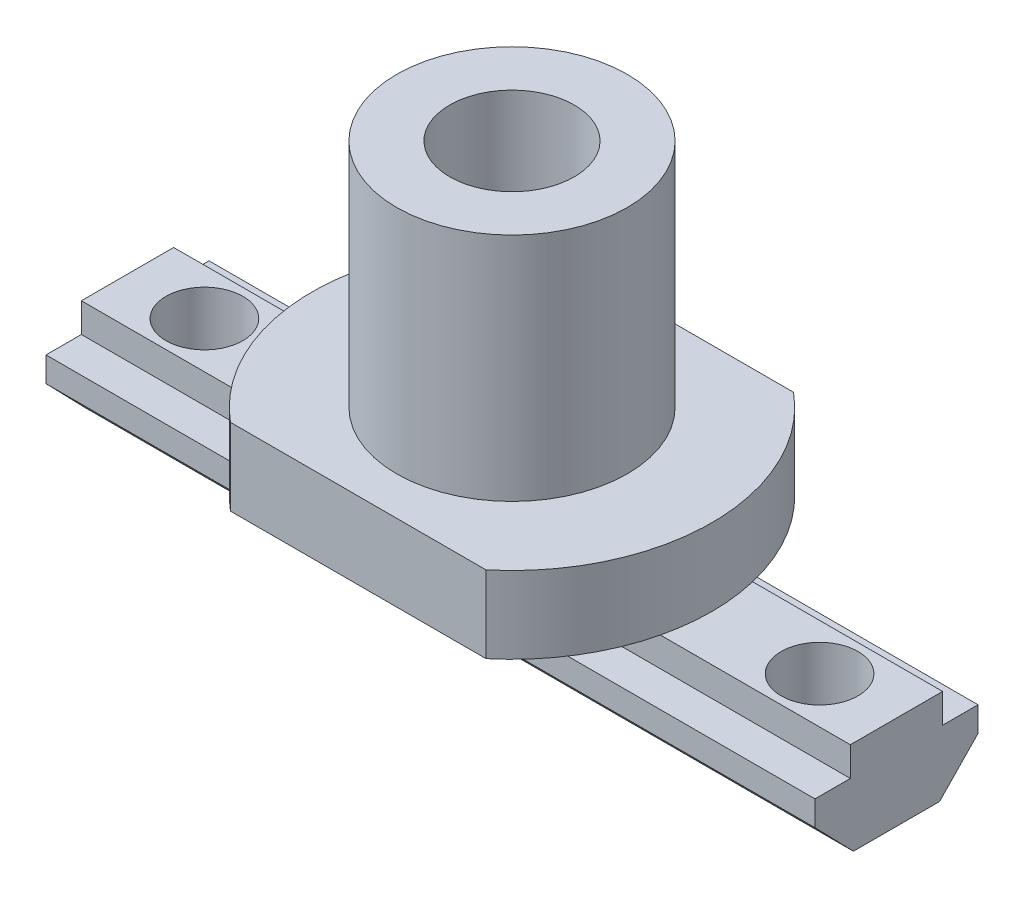
ISO-10303-21;
HEADER;
FILE_DESCRIPTION(('STEP AP214'),'2;1');
FILE_NAME('part.step','',(''),(''),'','','');
FILE_SCHEMA(('AUTOMOTIVE_DESIGN { 1 0 10303 214 1 1 1 1 }'));
ENDSEC;
DATA;
#1=APPLICATION_CONTEXT('core data for automotive mechanical design processes');
#2=APPLICATION_PROTOCOL_DEFINITION('international standard','automotive_design',2000,#1);
#3=PRODUCT_CONTEXT('',#1,'mechanical');
#4=PRODUCT('Part','Part','',(#3));
#5=PRODUCT_RELATED_PRODUCT_CATEGORY('part','',(#4));
#6=PRODUCT_DEFINITION_FORMATION('','',#4);
#7=PRODUCT_DEFINITION_CONTEXT('part definition',#1,'design');
#8=PRODUCT_DEFINITION('design','',#6,#7);
#9=PRODUCT_DEFINITION_SHAPE('','',#8);
#10=(LENGTH_UNIT() NAMED_UNIT(*) SI_UNIT(.MILLI.,.METRE.));
#11=(NAMED_UNIT(*) PLANE_ANGLE_UNIT() SI_UNIT($,.RADIAN.));
#12=(NAMED_UNIT(*) SI_UNIT($,.STERADIAN.) SOLID_ANGLE_UNIT());
#13=UNCERTAINTY_MEASURE_WITH_UNIT(LENGTH_MEASURE(1.E-05),#10,'distance_accuracy_value','');
#14=(GEOMETRIC_REPRESENTATION_CONTEXT(3) GLOBAL_UNCERTAINTY_ASSIGNED_CONTEXT((#13)) GLOBAL_UNIT_ASSIGNED_CONTEXT((#10,
#11,#12)) REPRESENTATION_CONTEXT('',''));
#15=CARTESIAN_POINT('',(0.,0.,0.));
#16=DIRECTION('',(0.,0.,1.));
#17=DIRECTION('',(1.,0.,0.));
#18=AXIS2_PLACEMENT_3D('',#15,#16,#17);
#19=CARTESIAN_POINT('',(25.,6.1,3.));
#20=DIRECTION('',(0.,-1.,0.));
#21=DIRECTION('',(0.,0.,-1.));
#22=AXIS2_PLACEMENT_3D('',#19,#20,#21);
#23=PLANE('',#22);
#24=CARTESIAN_POINT('',(-20.,6.1,0.));
#25=DIRECTION('',(0.,1.,0.));
#26=DIRECTION('',(0.,0.,1.));
#27=AXIS2_PLACEMENT_3D('',#24,#25,#26);
#28=CIRCLE('',#27,2.5);
#29=CARTESIAN_POINT('',(-20.,6.1,2.5));
#30=VERTEX_POINT('',#29);
#31=EDGE_CURVE('E445',#30,#30,#28,.T.);
#32=ORIENTED_EDGE('',*,*,#31,.F.);
#33=EDGE_LOOP('',(#32));
#34=FACE_BOUND('',#33,.T.);
#35=CARTESIAN_POINT('',(0.,6.1,0.));
#36=DIRECTION('',(0.,1.,0.));
#37=DIRECTION('',(0.,0.,1.));
#38=AXIS2_PLACEMENT_3D('',#35,#36,#37);
#39=CIRCLE('',#38,13.);
#40=CARTESIAN_POINT('',(-12.6491106406735,6.1,-3.));
#41=VERTEX_POINT('',#40);
#42=CARTESIAN_POINT('',(-12.6491106406735,6.1,3.));
#43=VERTEX_POINT('',#42);
#44=EDGE_CURVE('E49',#41,#43,#39,.T.);
#45=ORIENTED_EDGE('',*,*,#44,.F.);
#46=DIRECTION('',(-1.,0.,0.));
#47=VECTOR('',#46,1.);
#48=CARTESIAN_POINT('',(25.,6.1,-3.));
#49=LINE('',#48,#47);
#50=CARTESIAN_POINT('',(-25.,6.1,-3.));
#51=VERTEX_POINT('',#50);
#52=EDGE_CURVE('E306',#41,#51,#49,.T.);
#53=ORIENTED_EDGE('',*,*,#52,.T.);
#54=DIRECTION('',(0.,0.,1.));
#55=VECTOR('',#54,1.);
#56=CARTESIAN_POINT('',(-25.,6.1,3.));
#57=LINE('',#56,#55);
#58=CARTESIAN_POINT('',(-25.,6.1,3.));
#59=VERTEX_POINT('',#58);
#60=EDGE_CURVE('E244',#51,#59,#57,.T.);
#61=ORIENTED_EDGE('',*,*,#60,.T.);
#62=DIRECTION('',(-1.,0.,0.));
#63=VECTOR('',#62,1.);
#64=CARTESIAN_POINT('',(25.,6.1,3.));
#65=LINE('',#64,#63);
#66=EDGE_CURVE('E191',#43,#59,#65,.T.);
#67=ORIENTED_EDGE('',*,*,#66,.F.);
#68=EDGE_LOOP('',(#45,#53,#61,#67));
#69=FACE_BOUND('',#68,.T.);
#70=ADVANCED_FACE('F39',(#34,#69),#23,.F.);
#71=CARTESIAN_POINT('',(25.,6.1,3.));
#72=DIRECTION('',(0.,0.,-1.));
#73=DIRECTION('',(-1.,0.,0.));
#74=AXIS2_PLACEMENT_3D('',#71,#72,#73);
#75=PLANE('',#74);
#76=DIRECTION('',(0.,-1.,0.));
#77=VECTOR('',#76,1.);
#78=CARTESIAN_POINT('',(-25.,6.1,3.));
#79=LINE('',#78,#77);
#80=CARTESIAN_POINT('',(-25.,4.2,3.));
#81=VERTEX_POINT('',#80);
#82=EDGE_CURVE('E216',#59,#81,#79,.T.);
#83=ORIENTED_EDGE('',*,*,#82,.T.);
#84=DIRECTION('',(-1.,0.,0.));
#85=VECTOR('',#84,1.);
#86=CARTESIAN_POINT('',(25.,4.2,3.));
#87=LINE('',#86,#85);
#88=CARTESIAN_POINT('',(25.,4.2,3.));
#89=VERTEX_POINT('',#88);
#90=EDGE_CURVE('E43',#89,#81,#87,.T.);
#91=ORIENTED_EDGE('',*,*,#90,.F.);
#92=DIRECTION('',(0.,-1.,0.));
#93=VECTOR('',#92,1.);
#94=CARTESIAN_POINT('',(25.,6.1,3.));
#95=LINE('',#94,#93);
#96=CARTESIAN_POINT('',(25.,6.1,3.));
#97=VERTEX_POINT('',#96);
#98=EDGE_CURVE('E246',#97,#89,#95,.T.);
#99=ORIENTED_EDGE('',*,*,#98,.F.);
#100=CARTESIAN_POINT('',(12.6491106406735,6.1,3.));
#101=VERTEX_POINT('',#100);
#102=EDGE_CURVE('E193',#97,#101,#65,.T.);
#103=ORIENTED_EDGE('',*,*,#102,.T.);
#104=CARTESIAN_POINT('',(2.72075357208256,6.1,3.));
#105=VERTEX_POINT('',#104);
#106=EDGE_CURVE('E196',#101,#105,#65,.T.);
#107=ORIENTED_EDGE('',*,*,#106,.T.);
#108=CARTESIAN_POINT('',(-2.72075357208256,6.1,3.));
#109=VERTEX_POINT('',#108);
#110=EDGE_CURVE('E175',#105,#109,#65,.T.);
#111=ORIENTED_EDGE('',*,*,#110,.T.);
#112=EDGE_CURVE('E183',#109,#43,#65,.T.);
#113=ORIENTED_EDGE('',*,*,#112,.T.);
#114=ORIENTED_EDGE('',*,*,#66,.T.);
#115=EDGE_LOOP('',(#83,#91,#99,#103,#107,#111,#113,#114));
#116=FACE_BOUND('',#115,.T.);
#117=ADVANCED_FACE('F41',(#116),#75,.F.);
#118=CARTESIAN_POINT('',(25.,4.2,3.));
#119=DIRECTION('',(0.,-1.,0.));
#120=DIRECTION('',(0.,0.,-1.));
#121=AXIS2_PLACEMENT_3D('',#118,#119,#120);
#122=PLANE('',#121);
#123=DIRECTION('',(0.,0.,1.));
#124=VECTOR('',#123,1.);
#125=CARTESIAN_POINT('',(-25.,4.2,3.));
#126=LINE('',#125,#124);
#127=CARTESIAN_POINT('',(-25.,4.2,5.3));
#128=VERTEX_POINT('',#127);
#129=EDGE_CURVE('E219',#81,#128,#126,.T.);
#130=ORIENTED_EDGE('',*,*,#129,.T.);
#131=DIRECTION('',(-1.,0.,0.));
#132=VECTOR('',#131,1.);
#133=CARTESIAN_POINT('',(25.,4.2,5.3));
#134=LINE('',#133,#132);
#135=CARTESIAN_POINT('',(25.,4.2,5.3));
#136=VERTEX_POINT('',#135);
#137=EDGE_CURVE('E310',#136,#128,#134,.T.);
#138=ORIENTED_EDGE('',*,*,#137,.F.);
#139=DIRECTION('',(0.,0.,1.));
#140=VECTOR('',#139,1.);
#141=CARTESIAN_POINT('',(25.,4.2,3.));
#142=LINE('',#141,#140);
#143=EDGE_CURVE('E251',#89,#136,#142,.T.);
#144=ORIENTED_EDGE('',*,*,#143,.F.);
#145=ORIENTED_EDGE('',*,*,#90,.T.);
#146=EDGE_LOOP('',(#130,#138,#144,#145));
#147=FACE_BOUND('',#146,.T.);
#148=ADVANCED_FACE('F421',(#147),#122,.F.);
#149=CARTESIAN_POINT('',(25.,4.2,5.3));
#150=DIRECTION('',(0.,0.,-1.));
#151=DIRECTION('',(-1.,0.,0.));
#152=AXIS2_PLACEMENT_3D('',#149,#150,#151);
#153=PLANE('',#152);
#154=DIRECTION('',(0.,-1.,0.));
#155=VECTOR('',#154,1.);
#156=CARTESIAN_POINT('',(-25.,4.2,5.3));
#157=LINE('',#156,#155);
#158=CARTESIAN_POINT('',(-25.,2.58,5.3));
#159=VERTEX_POINT('',#158);
#160=EDGE_CURVE('E223',#128,#159,#157,.T.);
#161=ORIENTED_EDGE('',*,*,#160,.T.);
#162=DIRECTION('',(-1.,0.,0.));
#163=VECTOR('',#162,1.);
#164=CARTESIAN_POINT('',(25.,2.58,5.3));
#165=LINE('',#164,#163);
#166=CARTESIAN_POINT('',(25.,2.58,5.3));
#167=VERTEX_POINT('',#166);
#168=EDGE_CURVE('E317',#167,#159,#165,.T.);
#169=ORIENTED_EDGE('',*,*,#168,.F.);
#170=DIRECTION('',(0.,-1.,0.));
#171=VECTOR('',#170,1.);
#172=CARTESIAN_POINT('',(25.,4.2,5.3));
#173=LINE('',#172,#171);
#174=EDGE_CURVE('E256',#136,#167,#173,.T.);
#175=ORIENTED_EDGE('',*,*,#174,.F.);
#176=ORIENTED_EDGE('',*,*,#137,.T.);
#177=EDGE_LOOP('',(#161,#169,#175,#176));
#178=FACE_BOUND('',#177,.T.);
#179=ADVANCED_FACE('F513',(#178),#153,.F.);
#180=CARTESIAN_POINT('',(25.,0.,2.8));
#181=DIRECTION('',(0.,0.695884956767445,-0.718153275384003));
#182=DIRECTION('',(0.,0.718153275384003,0.695884956767445));
#183=AXIS2_PLACEMENT_3D('',#180,#181,#182);
#184=PLANE('',#183);
#185=DIRECTION('',(0.,-0.718153275384003,-0.695884956767445));
#186=VECTOR('',#185,1.);
#187=CARTESIAN_POINT('',(-25.,0.,2.8));
#188=LINE('',#187,#186);
#189=CARTESIAN_POINT('',(-25.,0.,2.8));
#190=VERTEX_POINT('',#189);
#191=EDGE_CURVE('E226',#159,#190,#188,.T.);
#192=ORIENTED_EDGE('',*,*,#191,.T.);
#193=DIRECTION('',(-1.,0.,0.));
#194=VECTOR('',#193,1.);
#195=CARTESIAN_POINT('',(25.,0.,2.8));
#196=LINE('',#195,#194);
#197=CARTESIAN_POINT('',(25.,0.,2.8));
#198=VERTEX_POINT('',#197);
#199=EDGE_CURVE('E324',#198,#190,#196,.T.);
#200=ORIENTED_EDGE('',*,*,#199,.F.);
#201=DIRECTION('',(0.,-0.718153275384003,-0.695884956767445));
#202=VECTOR('',#201,1.);
#203=CARTESIAN_POINT('',(25.,0.,2.8));
#204=LINE('',#203,#202);
#205=EDGE_CURVE('E263',#167,#198,#204,.T.);
#206=ORIENTED_EDGE('',*,*,#205,.F.);
#207=ORIENTED_EDGE('',*,*,#168,.T.);
#208=EDGE_LOOP('',(#192,#200,#206,#207));
#209=FACE_BOUND('',#208,.T.);
#210=ADVANCED_FACE('F498',(#209),#184,.F.);
#211=CARTESIAN_POINT('',(25.,0.,2.8));
#212=DIRECTION('',(0.,1.,0.));
#213=DIRECTION('',(0.,0.,1.));
#214=AXIS2_PLACEMENT_3D('',#211,#212,#213);
#215=PLANE('',#214);
#216=CARTESIAN_POINT('',(20.,0.,0.));
#217=DIRECTION('',(0.,1.,0.));
#218=DIRECTION('',(0.,0.,1.));
#219=AXIS2_PLACEMENT_3D('',#216,#217,#218);
#220=CIRCLE('',#219,2.5);
#221=CARTESIAN_POINT('',(20.,0.,2.5));
#222=VERTEX_POINT('',#221);
#223=EDGE_CURVE('E436',#222,#222,#220,.T.);
#224=ORIENTED_EDGE('',*,*,#223,.T.);
#225=EDGE_LOOP('',(#224));
#226=FACE_BOUND('',#225,.T.);
#227=CARTESIAN_POINT('',(-20.,0.,0.));
#228=DIRECTION('',(0.,1.,0.));
#229=DIRECTION('',(0.,0.,1.));
#230=AXIS2_PLACEMENT_3D('',#227,#228,#229);
#231=CIRCLE('',#230,2.5);
#232=CARTESIAN_POINT('',(-20.,0.,2.5));
#233=VERTEX_POINT('',#232);
#234=EDGE_CURVE('E437',#233,#233,#231,.T.);
#235=ORIENTED_EDGE('',*,*,#234,.T.);
#236=EDGE_LOOP('',(#235));
#237=FACE_BOUND('',#236,.T.);
#238=DIRECTION('',(0.,0.,-1.));
#239=VECTOR('',#238,1.);
#240=CARTESIAN_POINT('',(-25.,0.,2.8));
#241=LINE('',#240,#239);
#242=CARTESIAN_POINT('',(-25.,0.,-2.8));
#243=VERTEX_POINT('',#242);
#244=EDGE_CURVE('E229',#190,#243,#241,.T.);
#245=ORIENTED_EDGE('',*,*,#244,.T.);
#246=DIRECTION('',(-1.,0.,0.));
#247=VECTOR('',#246,1.);
#248=CARTESIAN_POINT('',(25.,0.,-2.8));
#249=LINE('',#248,#247);
#250=CARTESIAN_POINT('',(25.,0.,-2.8));
#251=VERTEX_POINT('',#250);
#252=EDGE_CURVE('E330',#251,#243,#249,.T.);
#253=ORIENTED_EDGE('',*,*,#252,.F.);
#254=DIRECTION('',(0.,0.,-1.));
#255=VECTOR('',#254,1.);
#256=CARTESIAN_POINT('',(25.,0.,2.8));
#257=LINE('',#256,#255);
#258=EDGE_CURVE('E266',#198,#251,#257,.T.);
#259=ORIENTED_EDGE('',*,*,#258,.F.);
#260=ORIENTED_EDGE('',*,*,#199,.T.);
#261=EDGE_LOOP('',(#245,#253,#259,#260));
#262=FACE_BOUND('',#261,.T.);
#263=ADVANCED_FACE('F494',(#226,#237,#262),#215,.F.);
#264=CARTESIAN_POINT('',(25.,0.,-2.8));
#265=DIRECTION('',(0.,0.695884956767445,0.718153275384003));
#266=DIRECTION('',(0.,-0.718153275384003,0.695884956767445));
#267=AXIS2_PLACEMENT_3D('',#264,#265,#266);
#268=PLANE('',#267);
#269=DIRECTION('',(0.,0.718153275384003,-0.695884956767445));
#270=VECTOR('',#269,1.);
#271=CARTESIAN_POINT('',(-25.,0.,-2.8));
#272=LINE('',#271,#270);
#273=CARTESIAN_POINT('',(-25.,2.58,-5.3));
#274=VERTEX_POINT('',#273);
#275=EDGE_CURVE('E232',#243,#274,#272,.T.);
#276=ORIENTED_EDGE('',*,*,#275,.T.);
#277=DIRECTION('',(-1.,0.,0.));
#278=VECTOR('',#277,1.);
#279=CARTESIAN_POINT('',(25.,2.58,-5.3));
#280=LINE('',#279,#278);
#281=CARTESIAN_POINT('',(25.,2.58,-5.3));
#282=VERTEX_POINT('',#281);
#283=EDGE_CURVE('E334',#282,#274,#280,.T.);
#284=ORIENTED_EDGE('',*,*,#283,.F.);
#285=DIRECTION('',(0.,0.718153275384003,-0.695884956767445));
#286=VECTOR('',#285,1.);
#287=CARTESIAN_POINT('',(25.,0.,-2.8));
#288=LINE('',#287,#286);
#289=EDGE_CURVE('E269',#251,#282,#288,.T.);
#290=ORIENTED_EDGE('',*,*,#289,.F.);
#291=ORIENTED_EDGE('',*,*,#252,.T.);
#292=EDGE_LOOP('',(#276,#284,#290,#291));
#293=FACE_BOUND('',#292,.T.);
#294=ADVANCED_FACE('F497',(#293),#268,.F.);
#295=CARTESIAN_POINT('',(25.,4.2,-5.3));
#296=DIRECTION('',(0.,0.,1.));
#297=DIRECTION('',(1.,0.,0.));
#298=AXIS2_PLACEMENT_3D('',#295,#296,#297);
#299=PLANE('',#298);
#300=DIRECTION('',(0.,1.,0.));
#301=VECTOR('',#300,1.);
#302=CARTESIAN_POINT('',(-25.,4.2,-5.3));
#303=LINE('',#302,#301);
#304=CARTESIAN_POINT('',(-25.,4.2,-5.3));
#305=VERTEX_POINT('',#304);
#306=EDGE_CURVE('E235',#274,#305,#303,.T.);
#307=ORIENTED_EDGE('',*,*,#306,.T.);
#308=DIRECTION('',(-1.,0.,0.));
#309=VECTOR('',#308,1.);
#310=CARTESIAN_POINT('',(25.,4.2,-5.3));
#311=LINE('',#310,#309);
#312=CARTESIAN_POINT('',(25.,4.2,-5.3));
#313=VERTEX_POINT('',#312);
#314=EDGE_CURVE('E291',#313,#305,#311,.T.);
#315=ORIENTED_EDGE('',*,*,#314,.F.);
#316=DIRECTION('',(0.,1.,0.));
#317=VECTOR('',#316,1.);
#318=CARTESIAN_POINT('',(25.,4.2,-5.3));
#319=LINE('',#318,#317);
#320=EDGE_CURVE('E272',#282,#313,#319,.T.);
#321=ORIENTED_EDGE('',*,*,#320,.F.);
#322=ORIENTED_EDGE('',*,*,#283,.T.);
#323=EDGE_LOOP('',(#307,#315,#321,#322));
#324=FACE_BOUND('',#323,.T.);
#325=ADVANCED_FACE('F524',(#324),#299,.F.);
#326=CARTESIAN_POINT('',(25.,4.2,-3.));
#327=DIRECTION('',(0.,-1.,0.));
#328=DIRECTION('',(0.,0.,-1.));
#329=AXIS2_PLACEMENT_3D('',#326,#327,#328);
#330=PLANE('',#329);
#331=DIRECTION('',(0.,0.,1.));
#332=VECTOR('',#331,1.);
#333=CARTESIAN_POINT('',(-25.,4.2,-3.));
#334=LINE('',#333,#332);
#335=CARTESIAN_POINT('',(-25.,4.2,-3.));
#336=VERTEX_POINT('',#335);
#337=EDGE_CURVE('E238',#305,#336,#334,.T.);
#338=ORIENTED_EDGE('',*,*,#337,.T.);
#339=DIRECTION('',(-1.,0.,0.));
#340=VECTOR('',#339,1.);
#341=CARTESIAN_POINT('',(25.,4.2,-3.));
#342=LINE('',#341,#340);
#343=CARTESIAN_POINT('',(25.,4.2,-3.));
#344=VERTEX_POINT('',#343);
#345=EDGE_CURVE('E285',#344,#336,#342,.T.);
#346=ORIENTED_EDGE('',*,*,#345,.F.);
#347=DIRECTION('',(0.,0.,1.));
#348=VECTOR('',#347,1.);
#349=CARTESIAN_POINT('',(25.,4.2,-3.));
#350=LINE('',#349,#348);
#351=EDGE_CURVE('E212',#313,#344,#350,.T.);
#352=ORIENTED_EDGE('',*,*,#351,.F.);
#353=ORIENTED_EDGE('',*,*,#314,.T.);
#354=EDGE_LOOP('',(#338,#346,#352,#353));
#355=FACE_BOUND('',#354,.T.);
#356=ADVANCED_FACE('F286',(#355),#330,.F.);
#357=CARTESIAN_POINT('',(25.,6.1,-3.));
#358=DIRECTION('',(0.,0.,1.));
#359=DIRECTION('',(1.,0.,0.));
#360=AXIS2_PLACEMENT_3D('',#357,#358,#359);
#361=PLANE('',#360);
#362=DIRECTION('',(0.,1.,0.));
#363=VECTOR('',#362,1.);
#364=CARTESIAN_POINT('',(-25.,6.1,-3.));
#365=LINE('',#364,#363);
#366=EDGE_CURVE('E241',#336,#51,#365,.T.);
#367=ORIENTED_EDGE('',*,*,#366,.T.);
#368=ORIENTED_EDGE('',*,*,#52,.F.);
#369=CARTESIAN_POINT('',(-2.72075357208256,6.1,-3.));
#370=VERTEX_POINT('',#369);
#371=EDGE_CURVE('E301',#370,#41,#49,.T.);
#372=ORIENTED_EDGE('',*,*,#371,.F.);
#373=CARTESIAN_POINT('',(2.72075357208256,6.1,-3.));
#374=VERTEX_POINT('',#373);
#375=EDGE_CURVE('E177',#374,#370,#49,.T.);
#376=ORIENTED_EDGE('',*,*,#375,.F.);
#377=CARTESIAN_POINT('',(12.6491106406735,6.1,-3.));
#378=VERTEX_POINT('',#377);
#379=EDGE_CURVE('E297',#378,#374,#49,.T.);
#380=ORIENTED_EDGE('',*,*,#379,.F.);
#381=CARTESIAN_POINT('',(25.,6.1,-3.));
#382=VERTEX_POINT('',#381);
#383=EDGE_CURVE('E292',#382,#378,#49,.T.);
#384=ORIENTED_EDGE('',*,*,#383,.F.);
#385=DIRECTION('',(0.,1.,0.));
#386=VECTOR('',#385,1.);
#387=CARTESIAN_POINT('',(25.,6.1,-3.));
#388=LINE('',#387,#386);
#389=EDGE_CURVE('E205',#344,#382,#388,.T.);
#390=ORIENTED_EDGE('',*,*,#389,.F.);
#391=ORIENTED_EDGE('',*,*,#345,.T.);
#392=EDGE_LOOP('',(#367,#368,#372,#376,#380,#384,#390,#391));
#393=FACE_BOUND('',#392,.T.);
#394=ADVANCED_FACE('F294',(#393),#361,.F.);
#395=CARTESIAN_POINT('',(20.,6.1,0.));
#396=DIRECTION('',(0.,1.,0.));
#397=DIRECTION('',(0.,0.,1.));
#398=AXIS2_PLACEMENT_3D('',#395,#396,#397);
#399=CIRCLE('',#398,2.5);
#400=CARTESIAN_POINT('',(20.,6.1,2.5));
#401=VERTEX_POINT('',#400);
#402=EDGE_CURVE('E433',#401,#401,#399,.T.);
#403=ORIENTED_EDGE('',*,*,#402,.F.);
#404=EDGE_LOOP('',(#403));
#405=FACE_BOUND('',#404,.T.);
#406=CARTESIAN_POINT('',(0.,6.1,0.));
#407=DIRECTION('',(0.,1.,0.));
#408=DIRECTION('',(0.,0.,1.));
#409=AXIS2_PLACEMENT_3D('',#406,#407,#408);
#410=CIRCLE('',#409,13.);
#411=EDGE_CURVE('E304',#101,#378,#410,.T.);
#412=ORIENTED_EDGE('',*,*,#411,.F.);
#413=ORIENTED_EDGE('',*,*,#102,.F.);
#414=DIRECTION('',(0.,0.,1.));
#415=VECTOR('',#414,1.);
#416=CARTESIAN_POINT('',(25.,6.1,3.));
#417=LINE('',#416,#415);
#418=EDGE_CURVE('E202',#382,#97,#417,.T.);
#419=ORIENTED_EDGE('',*,*,#418,.F.);
#420=ORIENTED_EDGE('',*,*,#383,.T.);
#421=EDGE_LOOP('',(#412,#413,#419,#420));
#422=FACE_BOUND('',#421,.T.);
#423=ADVANCED_FACE('F302',(#405,#422),#23,.F.);
#424=CARTESIAN_POINT('',(25.,0.,0.));
#425=DIRECTION('',(-1.,0.,0.));
#426=DIRECTION('',(0.,0.,1.));
#427=AXIS2_PLACEMENT_3D('',#424,#425,#426);
#428=PLANE('',#427);
#429=ORIENTED_EDGE('',*,*,#98,.T.);
#430=ORIENTED_EDGE('',*,*,#143,.T.);
#431=ORIENTED_EDGE('',*,*,#174,.T.);
#432=ORIENTED_EDGE('',*,*,#205,.T.);
#433=ORIENTED_EDGE('',*,*,#258,.T.);
#434=ORIENTED_EDGE('',*,*,#289,.T.);
#435=ORIENTED_EDGE('',*,*,#320,.T.);
#436=ORIENTED_EDGE('',*,*,#351,.T.);
#437=ORIENTED_EDGE('',*,*,#389,.T.);
#438=ORIENTED_EDGE('',*,*,#418,.T.);
#439=EDGE_LOOP('',(#429,#430,#431,#432,#433,#434,#435,#436,#437,#438));
#440=FACE_BOUND('',#439,.T.);
#441=ADVANCED_FACE('F277',(#440),#428,.F.);
#442=CARTESIAN_POINT('',(-25.,0.,0.));
#443=DIRECTION('',(-1.,0.,0.));
#444=DIRECTION('',(0.,0.,1.));
#445=AXIS2_PLACEMENT_3D('',#442,#443,#444);
#446=PLANE('',#445);
#447=ORIENTED_EDGE('',*,*,#82,.F.);
#448=ORIENTED_EDGE('',*,*,#60,.F.);
#449=ORIENTED_EDGE('',*,*,#366,.F.);
#450=ORIENTED_EDGE('',*,*,#337,.F.);
#451=ORIENTED_EDGE('',*,*,#306,.F.);
#452=ORIENTED_EDGE('',*,*,#275,.F.);
#453=ORIENTED_EDGE('',*,*,#244,.F.);
#454=ORIENTED_EDGE('',*,*,#191,.F.);
#455=ORIENTED_EDGE('',*,*,#160,.F.);
#456=ORIENTED_EDGE('',*,*,#129,.F.);
#457=EDGE_LOOP('',(#447,#448,#449,#450,#451,#452,#453,#454,#455,#456));
#458=FACE_BOUND('',#457,.T.);
#459=ADVANCED_FACE('F342',(#458),#446,.T.);
#460=CARTESIAN_POINT('',(0.,6.1,0.));
#461=DIRECTION('',(0.,1.,0.));
#462=DIRECTION('',(0.,0.,1.));
#463=AXIS2_PLACEMENT_3D('',#460,#461,#462);
#464=PLANE('',#463);
#465=ORIENTED_EDGE('',*,*,#379,.T.);
#466=CARTESIAN_POINT('',(0.,6.1,0.));
#467=DIRECTION('',(0.,-1.,0.));
#468=DIRECTION('',(0.,0.,-1.));
#469=AXIS2_PLACEMENT_3D('',#466,#467,#468);
#470=CIRCLE('',#469,4.05);
#471=EDGE_CURVE('E181',#374,#370,#470,.F.);
#472=ORIENTED_EDGE('',*,*,#471,.T.);
#473=ORIENTED_EDGE('',*,*,#371,.T.);
#474=CARTESIAN_POINT('',(-8.30662386291808,6.1,-10.));
#475=VERTEX_POINT('',#474);
#476=EDGE_CURVE('E352',#475,#41,#39,.T.);
#477=ORIENTED_EDGE('',*,*,#476,.F.);
#478=DIRECTION('',(-1.,0.,0.));
#479=VECTOR('',#478,1.);
#480=CARTESIAN_POINT('',(-8.30662386291808,6.1,-10.));
#481=LINE('',#480,#479);
#482=CARTESIAN_POINT('',(8.30662386291808,6.1,-10.));
#483=VERTEX_POINT('',#482);
#484=EDGE_CURVE('E372',#483,#475,#481,.T.);
#485=ORIENTED_EDGE('',*,*,#484,.F.);
#486=EDGE_CURVE('E315',#378,#483,#410,.T.);
#487=ORIENTED_EDGE('',*,*,#486,.F.);
#488=EDGE_LOOP('',(#465,#472,#473,#477,#485,#487));
#489=FACE_BOUND('',#488,.T.);
#490=ADVANCED_FACE('F401',(#489),#464,.F.);
#491=CARTESIAN_POINT('',(0.,11.1,0.));
#492=DIRECTION('',(0.,-1.,0.));
#493=DIRECTION('',(0.,0.,-1.));
#494=AXIS2_PLACEMENT_3D('',#491,#492,#493);
#495=CYLINDRICAL_SURFACE('',#494,13.);
#496=ORIENTED_EDGE('',*,*,#476,.T.);
#497=ORIENTED_EDGE('',*,*,#44,.T.);
#498=CARTESIAN_POINT('',(-8.30662386291808,6.1,10.));
#499=VERTEX_POINT('',#498);
#500=EDGE_CURVE('E186',#43,#499,#39,.T.);
#501=ORIENTED_EDGE('',*,*,#500,.T.);
#502=DIRECTION('',(0.,-1.,0.));
#503=VECTOR('',#502,1.);
#504=CARTESIAN_POINT('',(-8.30662386291808,11.1,10.));
#505=LINE('',#504,#503);
#506=CARTESIAN_POINT('',(-8.30662386291808,11.1,10.));
#507=VERTEX_POINT('',#506);
#508=EDGE_CURVE('E220',#507,#499,#505,.T.);
#509=ORIENTED_EDGE('',*,*,#508,.F.);
#510=CARTESIAN_POINT('',(0.,11.1,0.));
#511=DIRECTION('',(0.,1.,0.));
#512=DIRECTION('',(0.,0.,1.));
#513=AXIS2_PLACEMENT_3D('',#510,#511,#512);
#514=CIRCLE('',#513,13.);
#515=CARTESIAN_POINT('',(-8.30662386291808,11.1,-10.));
#516=VERTEX_POINT('',#515);
#517=EDGE_CURVE('E375',#516,#507,#514,.T.);
#518=ORIENTED_EDGE('',*,*,#517,.F.);
#519=DIRECTION('',(0.,-1.,0.));
#520=VECTOR('',#519,1.);
#521=CARTESIAN_POINT('',(-8.30662386291808,11.1,-10.));
#522=LINE('',#521,#520);
#523=EDGE_CURVE('E356',#516,#475,#522,.T.);
#524=ORIENTED_EDGE('',*,*,#523,.T.);
#525=EDGE_LOOP('',(#496,#497,#501,#509,#518,#524));
#526=FACE_BOUND('',#525,.T.);
#527=ADVANCED_FACE('F353',(#526),#495,.T.);
#528=CARTESIAN_POINT('',(8.30662386291808,11.1,10.));
#529=DIRECTION('',(0.,0.,-1.));
#530=DIRECTION('',(-1.,0.,0.));
#531=AXIS2_PLACEMENT_3D('',#528,#529,#530);
#532=PLANE('',#531);
#533=DIRECTION('',(1.,0.,0.));
#534=VECTOR('',#533,1.);
#535=CARTESIAN_POINT('',(8.30662386291808,6.1,10.));
#536=LINE('',#535,#534);
#537=CARTESIAN_POINT('',(8.30662386291808,6.1,10.));
#538=VERTEX_POINT('',#537);
#539=EDGE_CURVE('E360',#499,#538,#536,.T.);
#540=ORIENTED_EDGE('',*,*,#539,.T.);
#541=DIRECTION('',(0.,-1.,0.));
#542=VECTOR('',#541,1.);
#543=CARTESIAN_POINT('',(8.30662386291808,11.1,10.));
#544=LINE('',#543,#542);
#545=CARTESIAN_POINT('',(8.30662386291808,11.1,10.));
#546=VERTEX_POINT('',#545);
#547=EDGE_CURVE('E381',#546,#538,#544,.T.);
#548=ORIENTED_EDGE('',*,*,#547,.F.);
#549=DIRECTION('',(1.,0.,0.));
#550=VECTOR('',#549,1.);
#551=CARTESIAN_POINT('',(8.30662386291808,11.1,10.));
#552=LINE('',#551,#550);
#553=EDGE_CURVE('E393',#507,#546,#552,.T.);
#554=ORIENTED_EDGE('',*,*,#553,.F.);
#555=ORIENTED_EDGE('',*,*,#508,.T.);
#556=EDGE_LOOP('',(#540,#548,#554,#555));
#557=FACE_BOUND('',#556,.T.);
#558=ADVANCED_FACE('F392',(#557),#532,.F.);
#559=CARTESIAN_POINT('',(0.,11.1,0.));
#560=DIRECTION('',(0.,-1.,0.));
#561=DIRECTION('',(0.,0.,-1.));
#562=AXIS2_PLACEMENT_3D('',#559,#560,#561);
#563=CYLINDRICAL_SURFACE('',#562,13.);
#564=EDGE_CURVE('E314',#538,#101,#410,.T.);
#565=ORIENTED_EDGE('',*,*,#564,.T.);
#566=ORIENTED_EDGE('',*,*,#411,.T.);
#567=ORIENTED_EDGE('',*,*,#486,.T.);
#568=DIRECTION('',(0.,-1.,0.));
#569=VECTOR('',#568,1.);
#570=CARTESIAN_POINT('',(8.30662386291808,11.1,-10.));
#571=LINE('',#570,#569);
#572=CARTESIAN_POINT('',(8.30662386291808,11.1,-10.));
#573=VERTEX_POINT('',#572);
#574=EDGE_CURVE('E378',#573,#483,#571,.T.);
#575=ORIENTED_EDGE('',*,*,#574,.F.);
#576=CARTESIAN_POINT('',(0.,11.1,0.));
#577=DIRECTION('',(0.,1.,0.));
#578=DIRECTION('',(0.,0.,1.));
#579=AXIS2_PLACEMENT_3D('',#576,#577,#578);
#580=CIRCLE('',#579,13.);
#581=EDGE_CURVE('E460',#546,#573,#580,.T.);
#582=ORIENTED_EDGE('',*,*,#581,.F.);
#583=ORIENTED_EDGE('',*,*,#547,.T.);
#584=EDGE_LOOP('',(#565,#566,#567,#575,#582,#583));
#585=FACE_BOUND('',#584,.T.);
#586=ADVANCED_FACE('F395',(#585),#563,.T.);
#587=CARTESIAN_POINT('',(-8.30662386291808,11.1,-10.));
#588=DIRECTION('',(0.,0.,1.));
#589=DIRECTION('',(1.,0.,0.));
#590=AXIS2_PLACEMENT_3D('',#587,#588,#589);
#591=PLANE('',#590);
#592=ORIENTED_EDGE('',*,*,#484,.T.);
#593=ORIENTED_EDGE('',*,*,#523,.F.);
#594=DIRECTION('',(-1.,0.,0.));
#595=VECTOR('',#594,1.);
#596=CARTESIAN_POINT('',(-8.30662386291808,11.1,-10.));
#597=LINE('',#596,#595);
#598=EDGE_CURVE('E367',#573,#516,#597,.T.);
#599=ORIENTED_EDGE('',*,*,#598,.F.);
#600=ORIENTED_EDGE('',*,*,#574,.T.);
#601=EDGE_LOOP('',(#592,#593,#599,#600));
#602=FACE_BOUND('',#601,.T.);
#603=ADVANCED_FACE('F400',(#602),#591,.F.);
#604=CARTESIAN_POINT('',(0.,11.1,0.));
#605=DIRECTION('',(0.,1.,0.));
#606=DIRECTION('',(0.,0.,1.));
#607=AXIS2_PLACEMENT_3D('',#604,#605,#606);
#608=PLANE('',#607);
#609=CARTESIAN_POINT('',(0.,11.1,0.));
#610=DIRECTION('',(0.,1.,0.));
#611=DIRECTION('',(0.,0.,1.));
#612=AXIS2_PLACEMENT_3D('',#609,#610,#611);
#613=CIRCLE('',#612,7.5);
#614=CARTESIAN_POINT('',(0.,11.1,7.5));
#615=VERTEX_POINT('',#614);
#616=EDGE_CURVE('E11',#615,#615,#613,.T.);
#617=ORIENTED_EDGE('',*,*,#616,.F.);
#618=EDGE_LOOP('',(#617));
#619=FACE_BOUND('',#618,.T.);
#620=ORIENTED_EDGE('',*,*,#517,.T.);
#621=ORIENTED_EDGE('',*,*,#553,.T.);
#622=ORIENTED_EDGE('',*,*,#581,.T.);
#623=ORIENTED_EDGE('',*,*,#598,.T.);
#624=EDGE_LOOP('',(#620,#621,#622,#623));
#625=FACE_BOUND('',#624,.T.);
#626=ADVANCED_FACE('F414',(#619,#625),#608,.T.);
#627=ORIENTED_EDGE('',*,*,#112,.F.);
#628=EDGE_CURVE('E164',#109,#105,#470,.F.);
#629=ORIENTED_EDGE('',*,*,#628,.T.);
#630=ORIENTED_EDGE('',*,*,#106,.F.);
#631=ORIENTED_EDGE('',*,*,#564,.F.);
#632=ORIENTED_EDGE('',*,*,#539,.F.);
#633=ORIENTED_EDGE('',*,*,#500,.F.);
#634=EDGE_LOOP('',(#627,#629,#630,#631,#632,#633));
#635=FACE_BOUND('',#634,.T.);
#636=ADVANCED_FACE('F184',(#635),#464,.F.);
#637=CARTESIAN_POINT('',(0.,26.1,0.));
#638=DIRECTION('',(0.,-1.,0.));
#639=DIRECTION('',(0.,0.,-1.));
#640=AXIS2_PLACEMENT_3D('',#637,#638,#639);
#641=CYLINDRICAL_SURFACE('',#640,7.5);
#642=CARTESIAN_POINT('',(0.,26.1,0.));
#643=DIRECTION('',(0.,1.,0.));
#644=DIRECTION('',(0.,0.,1.));
#645=AXIS2_PLACEMENT_3D('',#642,#643,#644);
#646=CIRCLE('',#645,7.5);
#647=CARTESIAN_POINT('',(0.,26.1,7.5));
#648=VERTEX_POINT('',#647);
#649=EDGE_CURVE('E180',#648,#648,#646,.T.);
#650=ORIENTED_EDGE('',*,*,#649,.F.);
#651=EDGE_LOOP('',(#650));
#652=FACE_BOUND('',#651,.T.);
#653=ORIENTED_EDGE('',*,*,#616,.T.);
#654=EDGE_LOOP('',(#653));
#655=FACE_BOUND('',#654,.T.);
#656=ADVANCED_FACE('F413',(#652,#655),#641,.T.);
#657=CARTESIAN_POINT('',(0.,26.1,0.));
#658=DIRECTION('',(0.,1.,0.));
#659=DIRECTION('',(0.,0.,1.));
#660=AXIS2_PLACEMENT_3D('',#657,#658,#659);
#661=PLANE('',#660);
#662=CARTESIAN_POINT('',(0.,26.1,0.));
#663=DIRECTION('',(0.,1.,0.));
#664=DIRECTION('',(0.,0.,1.));
#665=AXIS2_PLACEMENT_3D('',#662,#663,#664);
#666=CIRCLE('',#665,4.05);
#667=CARTESIAN_POINT('',(0.,26.1,4.05));
#668=VERTEX_POINT('',#667);
#669=EDGE_CURVE('E442',#668,#668,#666,.T.);
#670=ORIENTED_EDGE('',*,*,#669,.F.);
#671=EDGE_LOOP('',(#670));
#672=FACE_BOUND('',#671,.T.);
#673=ORIENTED_EDGE('',*,*,#649,.T.);
#674=EDGE_LOOP('',(#673));
#675=FACE_BOUND('',#674,.T.);
#676=ADVANCED_FACE('F473',(#672,#675),#661,.T.);
#677=CARTESIAN_POINT('',(25.,6.1,3.));
#678=DIRECTION('',(0.,-1.,0.));
#679=DIRECTION('',(0.,0.,-1.));
#680=AXIS2_PLACEMENT_3D('',#677,#678,#679);
#681=PLANE('',#680);
#682=EDGE_CURVE('E62',#105,#374,#470,.F.);
#683=ORIENTED_EDGE('',*,*,#682,.T.);
#684=ORIENTED_EDGE('',*,*,#375,.T.);
#685=EDGE_CURVE('E57',#370,#109,#470,.F.);
#686=ORIENTED_EDGE('',*,*,#685,.T.);
#687=ORIENTED_EDGE('',*,*,#110,.F.);
#688=EDGE_LOOP('',(#683,#684,#686,#687));
#689=FACE_BOUND('',#688,.T.);
#690=ADVANCED_FACE('F173',(#689),#681,.F.);
#691=CARTESIAN_POINT('',(0.,-5.35512985522207,0.));
#692=DIRECTION('',(0.,1.,0.));
#693=DIRECTION('',(0.,0.,1.));
#694=AXIS2_PLACEMENT_3D('',#691,#692,#693);
#695=CYLINDRICAL_SURFACE('',#694,4.05);
#696=ORIENTED_EDGE('',*,*,#669,.T.);
#697=EDGE_LOOP('',(#696));
#698=FACE_BOUND('',#697,.T.);
#699=ORIENTED_EDGE('',*,*,#685,.F.);
#700=ORIENTED_EDGE('',*,*,#471,.F.);
#701=ORIENTED_EDGE('',*,*,#682,.F.);
#702=ORIENTED_EDGE('',*,*,#628,.F.);
#703=EDGE_LOOP('',(#699,#700,#701,#702));
#704=FACE_BOUND('',#703,.T.);
#705=ADVANCED_FACE('F165',(#698,#704),#695,.F.);
#706=CARTESIAN_POINT('',(20.,0.,0.));
#707=DIRECTION('',(0.,1.,0.));
#708=DIRECTION('',(0.,0.,1.));
#709=AXIS2_PLACEMENT_3D('',#706,#707,#708);
#710=CYLINDRICAL_SURFACE('',#709,2.5);
#711=ORIENTED_EDGE('',*,*,#223,.F.);
#712=EDGE_LOOP('',(#711));
#713=FACE_BOUND('',#712,.T.);
#714=ORIENTED_EDGE('',*,*,#402,.T.);
#715=EDGE_LOOP('',(#714));
#716=FACE_BOUND('',#715,.T.);
#717=ADVANCED_FACE('F482',(#713,#716),#710,.F.);
#718=CARTESIAN_POINT('',(-20.,0.,0.));
#719=DIRECTION('',(0.,1.,0.));
#720=DIRECTION('',(0.,0.,1.));
#721=AXIS2_PLACEMENT_3D('',#718,#719,#720);
#722=CYLINDRICAL_SURFACE('',#721,2.5);
#723=ORIENTED_EDGE('',*,*,#234,.F.);
#724=EDGE_LOOP('',(#723));
#725=FACE_BOUND('',#724,.T.);
#726=ORIENTED_EDGE('',*,*,#31,.T.);
#727=EDGE_LOOP('',(#726));
#728=FACE_BOUND('',#727,.T.);
#729=ADVANCED_FACE('F484',(#725,#728),#722,.F.);
#730=CLOSED_SHELL('',(#70,#117,#148,#179,#210,#263,#294,#325,#356,#394,#423,#441,#459,#490,#527,
#558,#586,#603,#626,#636,#656,#676,#690,#705,#717,#729));
#731=MANIFOLD_SOLID_BREP('B2',#730);
#732=ADVANCED_BREP_SHAPE_REPRESENTATION('',(#18,#731),#14);
#733=SHAPE_DEFINITION_REPRESENTATION(#9,#732);
ENDSEC;
END-ISO-10303-21;
